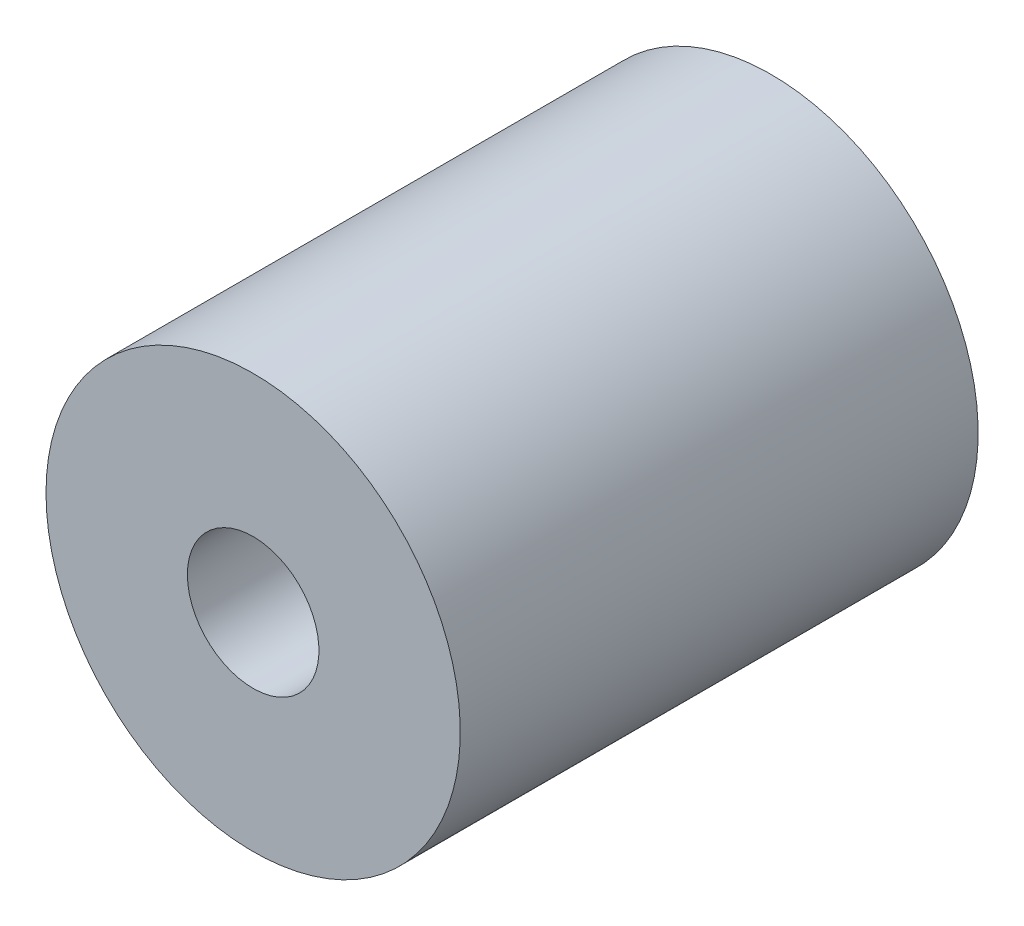
ISO-10303-21;
HEADER;
FILE_DESCRIPTION(('STEP AP214'),'2;1');
FILE_NAME('part.step','',(''),(''),'','','');
FILE_SCHEMA(('AUTOMOTIVE_DESIGN { 1 0 10303 214 1 1 1 1 }'));
ENDSEC;
DATA;
#1=APPLICATION_CONTEXT('core data for automotive mechanical design processes');
#2=APPLICATION_PROTOCOL_DEFINITION('international standard','automotive_design',2000,#1);
#3=PRODUCT_CONTEXT('',#1,'mechanical');
#4=PRODUCT('Part','Part','',(#3));
#5=PRODUCT_RELATED_PRODUCT_CATEGORY('part','',(#4));
#6=PRODUCT_DEFINITION_FORMATION('','',#4);
#7=PRODUCT_DEFINITION_CONTEXT('part definition',#1,'design');
#8=PRODUCT_DEFINITION('design','',#6,#7);
#9=PRODUCT_DEFINITION_SHAPE('','',#8);
#10=(LENGTH_UNIT() NAMED_UNIT(*) SI_UNIT(.MILLI.,.METRE.));
#11=(NAMED_UNIT(*) PLANE_ANGLE_UNIT() SI_UNIT($,.RADIAN.));
#12=(NAMED_UNIT(*) SI_UNIT($,.STERADIAN.) SOLID_ANGLE_UNIT());
#13=UNCERTAINTY_MEASURE_WITH_UNIT(LENGTH_MEASURE(1.E-05),#10,'distance_accuracy_value','');
#14=(GEOMETRIC_REPRESENTATION_CONTEXT(3) GLOBAL_UNCERTAINTY_ASSIGNED_CONTEXT((#13)) GLOBAL_UNIT_ASSIGNED_CONTEXT((#10,
#11,#12)) REPRESENTATION_CONTEXT('',''));
#15=CARTESIAN_POINT('',(0.,0.,0.));
#16=DIRECTION('',(0.,0.,1.));
#17=DIRECTION('',(1.,0.,0.));
#18=AXIS2_PLACEMENT_3D('',#15,#16,#17);
#19=CARTESIAN_POINT('',(0.,0.,0.));
#20=DIRECTION('',(0.,0.,1.));
#21=DIRECTION('',(1.,0.,0.));
#22=AXIS2_PLACEMENT_3D('',#19,#20,#21);
#23=CYLINDRICAL_SURFACE('',#22,10.);
#24=CARTESIAN_POINT('',(0.,0.,0.));
#25=DIRECTION('',(0.,0.,1.));
#26=DIRECTION('',(-1.,0.,0.));
#27=AXIS2_PLACEMENT_3D('',#24,#25,#26);
#28=CIRCLE('',#27,10.);
#29=CARTESIAN_POINT('',(-10.,0.,0.));
#30=VERTEX_POINT('',#29);
#31=EDGE_CURVE('E10',#30,#30,#28,.T.);
#32=ORIENTED_EDGE('',*,*,#31,.T.);
#33=EDGE_LOOP('',(#32));
#34=FACE_BOUND('',#33,.T.);
#35=CARTESIAN_POINT('',(0.,0.,25.));
#36=DIRECTION('',(0.,0.,1.));
#37=DIRECTION('',(-1.,0.,0.));
#38=AXIS2_PLACEMENT_3D('',#35,#36,#37);
#39=CIRCLE('',#38,10.);
#40=CARTESIAN_POINT('',(-10.,0.,25.));
#41=VERTEX_POINT('',#40);
#42=EDGE_CURVE('E37',#41,#41,#39,.T.);
#43=ORIENTED_EDGE('',*,*,#42,.F.);
#44=EDGE_LOOP('',(#43));
#45=FACE_BOUND('',#44,.T.);
#46=ADVANCED_FACE('F30',(#34,#45),#23,.T.);
#47=CARTESIAN_POINT('',(0.,0.,0.));
#48=DIRECTION('',(0.,0.,-1.));
#49=DIRECTION('',(-1.,0.,0.));
#50=AXIS2_PLACEMENT_3D('',#47,#48,#49);
#51=PLANE('',#50);
#52=CARTESIAN_POINT('',(0.,0.,0.));
#53=DIRECTION('',(0.,0.,-1.));
#54=DIRECTION('',(1.,0.,0.));
#55=AXIS2_PLACEMENT_3D('',#52,#53,#54);
#56=CIRCLE('',#55,2.5);
#57=CARTESIAN_POINT('',(2.5,0.,0.));
#58=VERTEX_POINT('',#57);
#59=EDGE_CURVE('E49',#58,#58,#56,.T.);
#60=ORIENTED_EDGE('',*,*,#59,.F.);
#61=EDGE_LOOP('',(#60));
#62=FACE_BOUND('',#61,.T.);
#63=ORIENTED_EDGE('',*,*,#31,.F.);
#64=EDGE_LOOP('',(#63));
#65=FACE_BOUND('',#64,.T.);
#66=ADVANCED_FACE('F68',(#62,#65),#51,.T.);
#67=CARTESIAN_POINT('',(0.,0.,25.));
#68=DIRECTION('',(0.,0.,-1.));
#69=DIRECTION('',(-1.,0.,0.));
#70=AXIS2_PLACEMENT_3D('',#67,#68,#69);
#71=PLANE('',#70);
#72=CARTESIAN_POINT('',(0.,0.,25.));
#73=DIRECTION('',(0.,0.,1.));
#74=DIRECTION('',(-1.,0.,0.));
#75=AXIS2_PLACEMENT_3D('',#72,#73,#74);
#76=CIRCLE('',#75,3.175);
#77=CARTESIAN_POINT('',(-3.175,0.,25.));
#78=VERTEX_POINT('',#77);
#79=EDGE_CURVE('E44',#78,#78,#76,.T.);
#80=ORIENTED_EDGE('',*,*,#79,.F.);
#81=EDGE_LOOP('',(#80));
#82=FACE_BOUND('',#81,.T.);
#83=ORIENTED_EDGE('',*,*,#42,.T.);
#84=EDGE_LOOP('',(#83));
#85=FACE_BOUND('',#84,.T.);
#86=ADVANCED_FACE('F72',(#82,#85),#71,.F.);
#87=CARTESIAN_POINT('',(0.,0.,12.5));
#88=DIRECTION('',(0.,0.,1.));
#89=DIRECTION('',(1.,0.,0.));
#90=AXIS2_PLACEMENT_3D('',#87,#88,#89);
#91=CYLINDRICAL_SURFACE('',#90,3.175);
#92=CARTESIAN_POINT('',(0.,0.,12.5));
#93=DIRECTION('',(0.,0.,1.));
#94=DIRECTION('',(-1.,0.,0.));
#95=AXIS2_PLACEMENT_3D('',#92,#93,#94);
#96=CIRCLE('',#95,3.175);
#97=CARTESIAN_POINT('',(-3.175,0.,12.5));
#98=VERTEX_POINT('',#97);
#99=EDGE_CURVE('E42',#98,#98,#96,.T.);
#100=ORIENTED_EDGE('',*,*,#99,.F.);
#101=EDGE_LOOP('',(#100));
#102=FACE_BOUND('',#101,.T.);
#103=ORIENTED_EDGE('',*,*,#79,.T.);
#104=EDGE_LOOP('',(#103));
#105=FACE_BOUND('',#104,.T.);
#106=ADVANCED_FACE('F65',(#102,#105),#91,.F.);
#107=CARTESIAN_POINT('',(0.,0.,12.5));
#108=DIRECTION('',(0.,0.,-1.));
#109=DIRECTION('',(-1.,0.,0.));
#110=AXIS2_PLACEMENT_3D('',#107,#108,#109);
#111=PLANE('',#110);
#112=CARTESIAN_POINT('',(0.,0.,12.5));
#113=DIRECTION('',(0.,0.,-1.));
#114=DIRECTION('',(-1.,0.,0.));
#115=AXIS2_PLACEMENT_3D('',#112,#113,#114);
#116=CIRCLE('',#115,2.5);
#117=CARTESIAN_POINT('',(-2.5,0.,12.5));
#118=VERTEX_POINT('',#117);
#119=EDGE_CURVE('E33',#118,#118,#116,.T.);
#120=ORIENTED_EDGE('',*,*,#119,.T.);
#121=EDGE_LOOP('',(#120));
#122=FACE_BOUND('',#121,.T.);
#123=ORIENTED_EDGE('',*,*,#99,.T.);
#124=EDGE_LOOP('',(#123));
#125=FACE_BOUND('',#124,.T.);
#126=ADVANCED_FACE('F56',(#122,#125),#111,.F.);
#127=CARTESIAN_POINT('',(0.,0.,25.));
#128=DIRECTION('',(0.,0.,-1.));
#129=DIRECTION('',(-1.,0.,0.));
#130=AXIS2_PLACEMENT_3D('',#127,#128,#129);
#131=CYLINDRICAL_SURFACE('',#130,2.5);
#132=ORIENTED_EDGE('',*,*,#59,.T.);
#133=EDGE_LOOP('',(#132));
#134=FACE_BOUND('',#133,.T.);
#135=ORIENTED_EDGE('',*,*,#119,.F.);
#136=EDGE_LOOP('',(#135));
#137=FACE_BOUND('',#136,.T.);
#138=ADVANCED_FACE('F59',(#134,#137),#131,.F.);
#139=CLOSED_SHELL('',(#46,#66,#86,#106,#126,#138));
#140=MANIFOLD_SOLID_BREP('B2',#139);
#141=ADVANCED_BREP_SHAPE_REPRESENTATION('',(#18,#140),#14);
#142=SHAPE_DEFINITION_REPRESENTATION(#9,#141);
ENDSEC;
END-ISO-10303-21;
